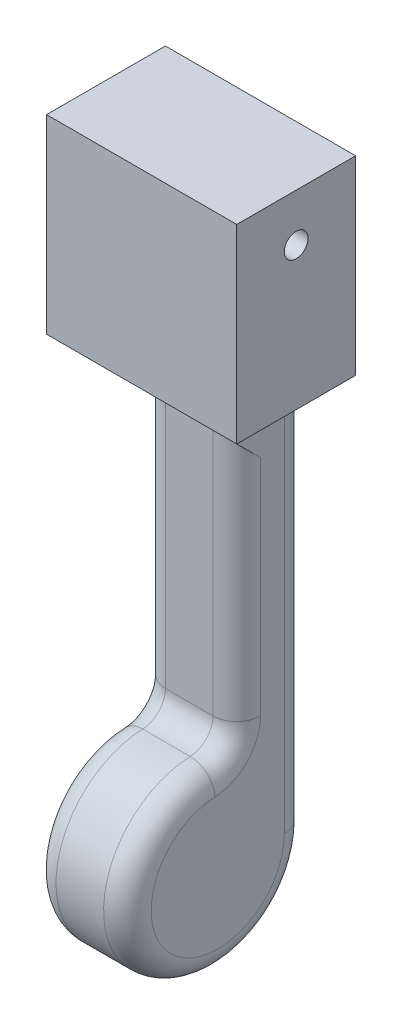
ISO-10303-21;
HEADER;
FILE_DESCRIPTION(('STEP AP214'),'2;1');
FILE_NAME('part.step','',(''),(''),'','','');
FILE_SCHEMA(('AUTOMOTIVE_DESIGN { 1 0 10303 214 1 1 1 1 }'));
ENDSEC;
DATA;
#1=APPLICATION_CONTEXT('core data for automotive mechanical design processes');
#2=APPLICATION_PROTOCOL_DEFINITION('international standard','automotive_design',2000,#1);
#3=PRODUCT_CONTEXT('',#1,'mechanical');
#4=PRODUCT('Part','Part','',(#3));
#5=PRODUCT_RELATED_PRODUCT_CATEGORY('part','',(#4));
#6=PRODUCT_DEFINITION_FORMATION('','',#4);
#7=PRODUCT_DEFINITION_CONTEXT('part definition',#1,'design');
#8=PRODUCT_DEFINITION('design','',#6,#7);
#9=PRODUCT_DEFINITION_SHAPE('','',#8);
#10=(LENGTH_UNIT() NAMED_UNIT(*) SI_UNIT(.MILLI.,.METRE.));
#11=(NAMED_UNIT(*) PLANE_ANGLE_UNIT() SI_UNIT($,.RADIAN.));
#12=(NAMED_UNIT(*) SI_UNIT($,.STERADIAN.) SOLID_ANGLE_UNIT());
#13=UNCERTAINTY_MEASURE_WITH_UNIT(LENGTH_MEASURE(1.E-05),#10,'distance_accuracy_value','');
#14=(GEOMETRIC_REPRESENTATION_CONTEXT(3) GLOBAL_UNCERTAINTY_ASSIGNED_CONTEXT((#13)) GLOBAL_UNIT_ASSIGNED_CONTEXT((#10,
#11,#12)) REPRESENTATION_CONTEXT('',''));
#15=CARTESIAN_POINT('',(0.,0.,0.));
#16=DIRECTION('',(0.,0.,1.));
#17=DIRECTION('',(1.,0.,0.));
#18=AXIS2_PLACEMENT_3D('',#15,#16,#17);
#19=CARTESIAN_POINT('',(20.,-20.,0.));
#20=DIRECTION('',(0.,-1.,0.));
#21=DIRECTION('',(0.,0.,-1.));
#22=AXIS2_PLACEMENT_3D('',#19,#20,#21);
#23=PLANE('',#22);
#24=DIRECTION('',(-1.,0.,0.));
#25=VECTOR('',#24,1.);
#26=CARTESIAN_POINT('',(20.,-20.,-12.5));
#27=LINE('',#26,#25);
#28=CARTESIAN_POINT('',(-5.,-20.,-12.5));
#29=VERTEX_POINT('',#28);
#30=CARTESIAN_POINT('',(-20.,-20.,-12.5));
#31=VERTEX_POINT('',#30);
#32=EDGE_CURVE('E162',#29,#31,#27,.T.);
#33=ORIENTED_EDGE('',*,*,#32,.F.);
#34=CARTESIAN_POINT('',(-5.,-20.,-7.5));
#35=DIRECTION('',(0.,-1.,0.));
#36=DIRECTION('',(0.,0.,-1.));
#37=AXIS2_PLACEMENT_3D('',#34,#35,#36);
#38=CIRCLE('',#37,5.);
#39=CARTESIAN_POINT('',(-10.,-20.,-7.5));
#40=VERTEX_POINT('',#39);
#41=EDGE_CURVE('E51',#29,#40,#38,.F.);
#42=ORIENTED_EDGE('',*,*,#41,.T.);
#43=DIRECTION('',(0.,0.,1.));
#44=VECTOR('',#43,1.);
#45=CARTESIAN_POINT('',(-10.,-20.,0.));
#46=LINE('',#45,#44);
#47=CARTESIAN_POINT('',(-10.,-20.,12.5));
#48=VERTEX_POINT('',#47);
#49=EDGE_CURVE('E161',#40,#48,#46,.T.);
#50=ORIENTED_EDGE('',*,*,#49,.T.);
#51=DIRECTION('',(-1.,0.,0.));
#52=VECTOR('',#51,1.);
#53=CARTESIAN_POINT('',(20.,-20.,12.5));
#54=LINE('',#53,#52);
#55=CARTESIAN_POINT('',(-20.,-20.,12.5));
#56=VERTEX_POINT('',#55);
#57=EDGE_CURVE('E186',#48,#56,#54,.T.);
#58=ORIENTED_EDGE('',*,*,#57,.T.);
#59=DIRECTION('',(0.,0.,1.));
#60=VECTOR('',#59,1.);
#61=CARTESIAN_POINT('',(-20.,-20.,0.));
#62=LINE('',#61,#60);
#63=EDGE_CURVE('E190',#31,#56,#62,.T.);
#64=ORIENTED_EDGE('',*,*,#63,.F.);
#65=EDGE_LOOP('',(#33,#42,#50,#58,#64));
#66=FACE_BOUND('',#65,.T.);
#67=ADVANCED_FACE('F42',(#66),#23,.T.);
#68=CARTESIAN_POINT('',(10.,0.,2.5));
#69=DIRECTION('',(0.,0.,-1.));
#70=DIRECTION('',(-1.,0.,0.));
#71=AXIS2_PLACEMENT_3D('',#68,#69,#70);
#72=PLANE('',#71);
#73=DIRECTION('',(-1.,0.,0.));
#74=VECTOR('',#73,1.);
#75=CARTESIAN_POINT('',(10.,-30.0000000000001,2.5));
#76=LINE('',#75,#74);
#77=CARTESIAN_POINT('',(5.,-30.0000000000001,2.5));
#78=VERTEX_POINT('',#77);
#79=CARTESIAN_POINT('',(-5.,-30.0000000000001,2.5));
#80=VERTEX_POINT('',#79);
#81=EDGE_CURVE('E211',#78,#80,#76,.T.);
#82=ORIENTED_EDGE('',*,*,#81,.T.);
#83=DIRECTION('',(0.,-1.,0.));
#84=VECTOR('',#83,1.);
#85=CARTESIAN_POINT('',(-5.,0.,2.5));
#86=LINE('',#85,#84);
#87=CARTESIAN_POINT('',(-5.,-82.0208423834364,2.5));
#88=VERTEX_POINT('',#87);
#89=EDGE_CURVE('E223',#80,#88,#86,.T.);
#90=ORIENTED_EDGE('',*,*,#89,.T.);
#91=DIRECTION('',(1.,0.,0.));
#92=VECTOR('',#91,1.);
#93=CARTESIAN_POINT('',(10.,-82.0208423834364,2.5));
#94=LINE('',#93,#92);
#95=CARTESIAN_POINT('',(5.,-82.0208423834364,2.5));
#96=VERTEX_POINT('',#95);
#97=EDGE_CURVE('E219',#88,#96,#94,.T.);
#98=ORIENTED_EDGE('',*,*,#97,.T.);
#99=DIRECTION('',(0.,-1.,0.));
#100=VECTOR('',#99,1.);
#101=CARTESIAN_POINT('',(5.,-30.0000000000001,2.5));
#102=LINE('',#101,#100);
#103=EDGE_CURVE('E221',#96,#78,#102,.F.);
#104=ORIENTED_EDGE('',*,*,#103,.T.);
#105=EDGE_LOOP('',(#82,#90,#98,#104));
#106=FACE_BOUND('',#105,.T.);
#107=ADVANCED_FACE('F349',(#106),#72,.F.);
#108=CARTESIAN_POINT('',(10.,-106.,6.49999999999999));
#109=DIRECTION('',(-1.,0.,0.));
#110=DIRECTION('',(0.,0.,1.));
#111=AXIS2_PLACEMENT_3D('',#108,#109,#110);
#112=CYLINDRICAL_SURFACE('',#111,19.);
#113=DIRECTION('',(-1.,0.,0.));
#114=VECTOR('',#113,1.);
#115=CARTESIAN_POINT('',(10.,-87.0165002202205,7.29166666666667));
#116=LINE('',#115,#114);
#117=CARTESIAN_POINT('',(5.,-87.0165002202205,7.29166666666667));
#118=VERTEX_POINT('',#117);
#119=CARTESIAN_POINT('',(-5.,-87.0165002202205,7.29166666666667));
#120=VERTEX_POINT('',#119);
#121=EDGE_CURVE('E59',#118,#120,#116,.T.);
#122=ORIENTED_EDGE('',*,*,#121,.T.);
#123=CARTESIAN_POINT('',(-5.,-106.,6.49999999999999));
#124=DIRECTION('',(1.,0.,0.));
#125=DIRECTION('',(0.,0.,-1.));
#126=AXIS2_PLACEMENT_3D('',#123,#124,#125);
#127=CIRCLE('',#126,19.);
#128=CARTESIAN_POINT('',(-5.,-106.,-12.5));
#129=VERTEX_POINT('',#128);
#130=EDGE_CURVE('E252',#120,#129,#127,.T.);
#131=ORIENTED_EDGE('',*,*,#130,.T.);
#132=DIRECTION('',(-1.,0.,0.));
#133=VECTOR('',#132,1.);
#134=CARTESIAN_POINT('',(10.,-106.,-12.5));
#135=LINE('',#134,#133);
#136=CARTESIAN_POINT('',(5.,-106.,-12.5));
#137=VERTEX_POINT('',#136);
#138=EDGE_CURVE('E208',#137,#129,#135,.T.);
#139=ORIENTED_EDGE('',*,*,#138,.F.);
#140=CARTESIAN_POINT('',(5.,-106.,6.49999999999999));
#141=DIRECTION('',(1.,0.,0.));
#142=DIRECTION('',(0.,0.,-1.));
#143=AXIS2_PLACEMENT_3D('',#140,#141,#142);
#144=CIRCLE('',#143,19.);
#145=EDGE_CURVE('E64',#137,#118,#144,.F.);
#146=ORIENTED_EDGE('',*,*,#145,.T.);
#147=EDGE_LOOP('',(#122,#131,#139,#146));
#148=FACE_BOUND('',#147,.T.);
#149=ADVANCED_FACE('F315',(#148),#112,.T.);
#150=CARTESIAN_POINT('',(10.,0.,-12.5));
#151=DIRECTION('',(0.,0.,-1.));
#152=DIRECTION('',(0.,1.,0.));
#153=AXIS2_PLACEMENT_3D('',#150,#151,#152);
#154=PLANE('',#153);
#155=ORIENTED_EDGE('',*,*,#138,.T.);
#156=DIRECTION('',(0.,-1.,0.));
#157=VECTOR('',#156,1.);
#158=CARTESIAN_POINT('',(-5.,-20.,-12.5));
#159=LINE('',#158,#157);
#160=EDGE_CURVE('E247',#129,#29,#159,.F.);
#161=ORIENTED_EDGE('',*,*,#160,.T.);
#162=ORIENTED_EDGE('',*,*,#32,.T.);
#163=DIRECTION('',(0.,1.,0.));
#164=VECTOR('',#163,1.);
#165=CARTESIAN_POINT('',(-20.,0.,-12.5));
#166=LINE('',#165,#164);
#167=CARTESIAN_POINT('',(-20.,20.,-12.5));
#168=VERTEX_POINT('',#167);
#169=EDGE_CURVE('E193',#31,#168,#166,.T.);
#170=ORIENTED_EDGE('',*,*,#169,.T.);
#171=DIRECTION('',(-1.,0.,0.));
#172=VECTOR('',#171,1.);
#173=CARTESIAN_POINT('',(20.,20.,-12.5));
#174=LINE('',#173,#172);
#175=CARTESIAN_POINT('',(20.,20.,-12.5));
#176=VERTEX_POINT('',#175);
#177=EDGE_CURVE('E169',#176,#168,#174,.T.);
#178=ORIENTED_EDGE('',*,*,#177,.F.);
#179=DIRECTION('',(0.,1.,0.));
#180=VECTOR('',#179,1.);
#181=CARTESIAN_POINT('',(20.,0.,-12.5));
#182=LINE('',#181,#180);
#183=CARTESIAN_POINT('',(20.,-20.,-12.5));
#184=VERTEX_POINT('',#183);
#185=EDGE_CURVE('E165',#184,#176,#182,.T.);
#186=ORIENTED_EDGE('',*,*,#185,.F.);
#187=CARTESIAN_POINT('',(5.,-20.,-12.5));
#188=VERTEX_POINT('',#187);
#189=EDGE_CURVE('E150',#184,#188,#27,.T.);
#190=ORIENTED_EDGE('',*,*,#189,.T.);
#191=DIRECTION('',(0.,-1.,0.));
#192=VECTOR('',#191,1.);
#193=CARTESIAN_POINT('',(5.,0.,-12.5));
#194=LINE('',#193,#192);
#195=EDGE_CURVE('E245',#188,#137,#194,.T.);
#196=ORIENTED_EDGE('',*,*,#195,.T.);
#197=EDGE_LOOP('',(#155,#161,#162,#170,#178,#186,#190,#196));
#198=FACE_BOUND('',#197,.T.);
#199=ADVANCED_FACE('F167',(#198),#154,.T.);
#200=CARTESIAN_POINT('',(10.,0.,0.));
#201=DIRECTION('',(1.,0.,0.));
#202=DIRECTION('',(0.,0.,-1.));
#203=AXIS2_PLACEMENT_3D('',#200,#201,#202);
#204=PLANE('',#203);
#205=DIRECTION('',(0.,-0.707106781186551,-0.707106781186544));
#206=VECTOR('',#205,1.);
#207=CARTESIAN_POINT('',(10.,-30.0000000000001,2.5));
#208=LINE('',#207,#206);
#209=CARTESIAN_POINT('',(10.,-20.,12.5));
#210=VERTEX_POINT('',#209);
#211=CARTESIAN_POINT('',(10.,-35.0000000000001,-2.5));
#212=VERTEX_POINT('',#211);
#213=EDGE_CURVE('E217',#210,#212,#208,.T.);
#214=ORIENTED_EDGE('',*,*,#213,.T.);
#215=DIRECTION('',(0.,-1.,0.));
#216=VECTOR('',#215,1.);
#217=CARTESIAN_POINT('',(10.,-87.4258243789933,-2.5));
#218=LINE('',#217,#216);
#219=CARTESIAN_POINT('',(10.,-82.0208423834364,-2.5));
#220=VERTEX_POINT('',#219);
#221=EDGE_CURVE('E243',#212,#220,#218,.T.);
#222=ORIENTED_EDGE('',*,*,#221,.T.);
#223=CARTESIAN_POINT('',(10.,-82.0208423834364,7.5));
#224=DIRECTION('',(1.,0.,0.));
#225=DIRECTION('',(0.,0.,-1.));
#226=AXIS2_PLACEMENT_3D('',#223,#224,#225);
#227=CIRCLE('',#226,10.);
#228=CARTESIAN_POINT('',(10.,-92.0121580570046,7.08333333333333));
#229=VERTEX_POINT('',#228);
#230=EDGE_CURVE('E240',#229,#220,#227,.T.);
#231=ORIENTED_EDGE('',*,*,#230,.F.);
#232=CARTESIAN_POINT('',(10.,-106.,6.49999999999999));
#233=DIRECTION('',(1.,0.,0.));
#234=DIRECTION('',(0.,0.,-1.));
#235=AXIS2_PLACEMENT_3D('',#232,#233,#234);
#236=CIRCLE('',#235,14.);
#237=CARTESIAN_POINT('',(10.,-106.,-7.50000000000001));
#238=VERTEX_POINT('',#237);
#239=EDGE_CURVE('E236',#229,#238,#236,.T.);
#240=ORIENTED_EDGE('',*,*,#239,.T.);
#241=DIRECTION('',(0.,-1.,0.));
#242=VECTOR('',#241,1.);
#243=CARTESIAN_POINT('',(10.,0.,-7.5));
#244=LINE('',#243,#242);
#245=CARTESIAN_POINT('',(10.,-20.,-7.5));
#246=VERTEX_POINT('',#245);
#247=EDGE_CURVE('E238',#238,#246,#244,.F.);
#248=ORIENTED_EDGE('',*,*,#247,.T.);
#249=DIRECTION('',(0.,0.,1.));
#250=VECTOR('',#249,1.);
#251=CARTESIAN_POINT('',(10.,-20.,0.));
#252=LINE('',#251,#250);
#253=EDGE_CURVE('E206',#246,#210,#252,.T.);
#254=ORIENTED_EDGE('',*,*,#253,.T.);
#255=EDGE_LOOP('',(#214,#222,#231,#240,#248,#254));
#256=FACE_BOUND('',#255,.T.);
#257=ADVANCED_FACE('F289',(#256),#204,.T.);
#258=CARTESIAN_POINT('',(-10.,0.,0.));
#259=DIRECTION('',(1.,0.,0.));
#260=DIRECTION('',(0.,0.,-1.));
#261=AXIS2_PLACEMENT_3D('',#258,#259,#260);
#262=PLANE('',#261);
#263=DIRECTION('',(0.,-1.,0.));
#264=VECTOR('',#263,1.);
#265=CARTESIAN_POINT('',(-10.,0.,-2.5));
#266=LINE('',#265,#264);
#267=CARTESIAN_POINT('',(-10.,-82.0208423834364,-2.5));
#268=VERTEX_POINT('',#267);
#269=CARTESIAN_POINT('',(-10.,-35.0000000000001,-2.5));
#270=VERTEX_POINT('',#269);
#271=EDGE_CURVE('E233',#268,#270,#266,.F.);
#272=ORIENTED_EDGE('',*,*,#271,.T.);
#273=DIRECTION('',(0.,0.707106781186551,0.707106781186544));
#274=VECTOR('',#273,1.);
#275=CARTESIAN_POINT('',(-10.,-16.2499999999999,16.2500000000001));
#276=LINE('',#275,#274);
#277=EDGE_CURVE('E214',#270,#48,#276,.T.);
#278=ORIENTED_EDGE('',*,*,#277,.T.);
#279=ORIENTED_EDGE('',*,*,#49,.F.);
#280=DIRECTION('',(0.,-1.,0.));
#281=VECTOR('',#280,1.);
#282=CARTESIAN_POINT('',(-10.,-106.,-7.5));
#283=LINE('',#282,#281);
#284=CARTESIAN_POINT('',(-10.,-106.,-7.50000000000001));
#285=VERTEX_POINT('',#284);
#286=EDGE_CURVE('E231',#40,#285,#283,.T.);
#287=ORIENTED_EDGE('',*,*,#286,.T.);
#288=CARTESIAN_POINT('',(-10.,-106.,6.49999999999999));
#289=DIRECTION('',(1.,0.,0.));
#290=DIRECTION('',(0.,0.,-1.));
#291=AXIS2_PLACEMENT_3D('',#288,#289,#290);
#292=CIRCLE('',#291,14.);
#293=CARTESIAN_POINT('',(-10.,-92.0121580570046,7.08333333333333));
#294=VERTEX_POINT('',#293);
#295=EDGE_CURVE('E229',#285,#294,#292,.F.);
#296=ORIENTED_EDGE('',*,*,#295,.T.);
#297=CARTESIAN_POINT('',(-10.,-82.0208423834364,7.5));
#298=DIRECTION('',(1.,0.,0.));
#299=DIRECTION('',(0.,0.,-1.));
#300=AXIS2_PLACEMENT_3D('',#297,#298,#299);
#301=CIRCLE('',#300,10.);
#302=EDGE_CURVE('E226',#268,#294,#301,.F.);
#303=ORIENTED_EDGE('',*,*,#302,.F.);
#304=EDGE_LOOP('',(#272,#278,#279,#287,#296,#303));
#305=FACE_BOUND('',#304,.T.);
#306=ADVANCED_FACE('F325',(#305),#262,.F.);
#307=CARTESIAN_POINT('',(20.,-20.,12.5));
#308=VERTEX_POINT('',#307);
#309=EDGE_CURVE('E200',#308,#210,#54,.T.);
#310=ORIENTED_EDGE('',*,*,#309,.T.);
#311=ORIENTED_EDGE('',*,*,#253,.F.);
#312=CARTESIAN_POINT('',(5.,-20.,-7.5));
#313=DIRECTION('',(0.,-1.,0.));
#314=DIRECTION('',(0.,0.,-1.));
#315=AXIS2_PLACEMENT_3D('',#312,#313,#314);
#316=CIRCLE('',#315,5.);
#317=EDGE_CURVE('E11',#246,#188,#316,.F.);
#318=ORIENTED_EDGE('',*,*,#317,.T.);
#319=ORIENTED_EDGE('',*,*,#189,.F.);
#320=DIRECTION('',(0.,0.,1.));
#321=VECTOR('',#320,1.);
#322=CARTESIAN_POINT('',(20.,-20.,0.));
#323=LINE('',#322,#321);
#324=EDGE_CURVE('E155',#184,#308,#323,.T.);
#325=ORIENTED_EDGE('',*,*,#324,.T.);
#326=EDGE_LOOP('',(#310,#311,#318,#319,#325));
#327=FACE_BOUND('',#326,.T.);
#328=ADVANCED_FACE('F153',(#327),#23,.T.);
#329=CARTESIAN_POINT('',(20.,20.,0.));
#330=DIRECTION('',(0.,1.,0.));
#331=DIRECTION('',(0.,0.,1.));
#332=AXIS2_PLACEMENT_3D('',#329,#330,#331);
#333=PLANE('',#332);
#334=DIRECTION('',(0.,0.,-1.));
#335=VECTOR('',#334,1.);
#336=CARTESIAN_POINT('',(-20.,20.,0.));
#337=LINE('',#336,#335);
#338=CARTESIAN_POINT('',(-20.,20.,12.5));
#339=VERTEX_POINT('',#338);
#340=EDGE_CURVE('E195',#339,#168,#337,.T.);
#341=ORIENTED_EDGE('',*,*,#340,.F.);
#342=DIRECTION('',(-1.,0.,0.));
#343=VECTOR('',#342,1.);
#344=CARTESIAN_POINT('',(20.,20.,12.5));
#345=LINE('',#344,#343);
#346=CARTESIAN_POINT('',(20.,20.,12.5));
#347=VERTEX_POINT('',#346);
#348=EDGE_CURVE('E202',#347,#339,#345,.T.);
#349=ORIENTED_EDGE('',*,*,#348,.F.);
#350=DIRECTION('',(0.,0.,-1.));
#351=VECTOR('',#350,1.);
#352=CARTESIAN_POINT('',(20.,20.,0.));
#353=LINE('',#352,#351);
#354=EDGE_CURVE('E173',#347,#176,#353,.T.);
#355=ORIENTED_EDGE('',*,*,#354,.T.);
#356=ORIENTED_EDGE('',*,*,#177,.T.);
#357=EDGE_LOOP('',(#341,#349,#355,#356));
#358=FACE_BOUND('',#357,.T.);
#359=ADVANCED_FACE('F336',(#358),#333,.T.);
#360=CARTESIAN_POINT('',(20.,10.,0.));
#361=DIRECTION('',(-1.,0.,0.));
#362=DIRECTION('',(0.,0.,1.));
#363=AXIS2_PLACEMENT_3D('',#360,#361,#362);
#364=CYLINDRICAL_SURFACE('',#363,2.5);
#365=CARTESIAN_POINT('',(20.,10.,0.));
#366=DIRECTION('',(1.,0.,0.));
#367=DIRECTION('',(0.,0.,-1.));
#368=AXIS2_PLACEMENT_3D('',#365,#366,#367);
#369=CIRCLE('',#368,2.5);
#370=CARTESIAN_POINT('',(20.,10.,-2.5));
#371=VERTEX_POINT('',#370);
#372=EDGE_CURVE('E178',#371,#371,#369,.T.);
#373=ORIENTED_EDGE('',*,*,#372,.T.);
#374=EDGE_LOOP('',(#373));
#375=FACE_BOUND('',#374,.T.);
#376=CARTESIAN_POINT('',(-20.,10.,0.));
#377=DIRECTION('',(1.,0.,0.));
#378=DIRECTION('',(0.,0.,-1.));
#379=AXIS2_PLACEMENT_3D('',#376,#377,#378);
#380=CIRCLE('',#379,2.5);
#381=CARTESIAN_POINT('',(-20.,10.,-2.5));
#382=VERTEX_POINT('',#381);
#383=EDGE_CURVE('E187',#382,#382,#380,.T.);
#384=ORIENTED_EDGE('',*,*,#383,.F.);
#385=EDGE_LOOP('',(#384));
#386=FACE_BOUND('',#385,.T.);
#387=ADVANCED_FACE('F338',(#375,#386),#364,.F.);
#388=CARTESIAN_POINT('',(20.,0.,12.5));
#389=DIRECTION('',(0.,0.,1.));
#390=DIRECTION('',(1.,0.,0.));
#391=AXIS2_PLACEMENT_3D('',#388,#389,#390);
#392=PLANE('',#391);
#393=DIRECTION('',(0.,1.,0.));
#394=VECTOR('',#393,1.);
#395=CARTESIAN_POINT('',(-20.,0.,12.5));
#396=LINE('',#395,#394);
#397=EDGE_CURVE('E181',#56,#339,#396,.T.);
#398=ORIENTED_EDGE('',*,*,#397,.F.);
#399=ORIENTED_EDGE('',*,*,#57,.F.);
#400=EDGE_CURVE('E203',#210,#48,#54,.T.);
#401=ORIENTED_EDGE('',*,*,#400,.F.);
#402=ORIENTED_EDGE('',*,*,#309,.F.);
#403=DIRECTION('',(0.,1.,0.));
#404=VECTOR('',#403,1.);
#405=CARTESIAN_POINT('',(20.,0.,12.5));
#406=LINE('',#405,#404);
#407=EDGE_CURVE('E177',#308,#347,#406,.T.);
#408=ORIENTED_EDGE('',*,*,#407,.T.);
#409=ORIENTED_EDGE('',*,*,#348,.T.);
#410=EDGE_LOOP('',(#398,#399,#401,#402,#408,#409));
#411=FACE_BOUND('',#410,.T.);
#412=ADVANCED_FACE('F330',(#411),#392,.T.);
#413=CARTESIAN_POINT('',(20.,0.,0.));
#414=DIRECTION('',(1.,0.,0.));
#415=DIRECTION('',(0.,0.,-1.));
#416=AXIS2_PLACEMENT_3D('',#413,#414,#415);
#417=PLANE('',#416);
#418=ORIENTED_EDGE('',*,*,#372,.F.);
#419=EDGE_LOOP('',(#418));
#420=FACE_BOUND('',#419,.T.);
#421=ORIENTED_EDGE('',*,*,#324,.F.);
#422=ORIENTED_EDGE('',*,*,#185,.T.);
#423=ORIENTED_EDGE('',*,*,#354,.F.);
#424=ORIENTED_EDGE('',*,*,#407,.F.);
#425=EDGE_LOOP('',(#421,#422,#423,#424));
#426=FACE_BOUND('',#425,.T.);
#427=ADVANCED_FACE('F175',(#420,#426),#417,.T.);
#428=CARTESIAN_POINT('',(-20.,0.,0.));
#429=DIRECTION('',(1.,0.,0.));
#430=DIRECTION('',(0.,0.,-1.));
#431=AXIS2_PLACEMENT_3D('',#428,#429,#430);
#432=PLANE('',#431);
#433=ORIENTED_EDGE('',*,*,#383,.T.);
#434=EDGE_LOOP('',(#433));
#435=FACE_BOUND('',#434,.T.);
#436=ORIENTED_EDGE('',*,*,#63,.T.);
#437=ORIENTED_EDGE('',*,*,#397,.T.);
#438=ORIENTED_EDGE('',*,*,#340,.T.);
#439=ORIENTED_EDGE('',*,*,#169,.F.);
#440=EDGE_LOOP('',(#436,#437,#438,#439));
#441=FACE_BOUND('',#440,.T.);
#442=ADVANCED_FACE('F333',(#435,#441),#432,.F.);
#443=CARTESIAN_POINT('',(10.,-30.0000000000001,2.5));
#444=DIRECTION('',(0.,0.707106781186544,-0.707106781186552));
#445=DIRECTION('',(-1.,0.,0.));
#446=AXIS2_PLACEMENT_3D('',#443,#444,#445);
#447=PLANE('',#446);
#448=ORIENTED_EDGE('',*,*,#213,.F.);
#449=ORIENTED_EDGE('',*,*,#400,.T.);
#450=ORIENTED_EDGE('',*,*,#277,.F.);
#451=CARTESIAN_POINT('',(-5.,-35.0000000000001,-2.5));
#452=DIRECTION('',(0.,0.707106781186544,-0.707106781186552));
#453=DIRECTION('',(0.,-0.707106781186551,-0.707106781186544));
#454=AXIS2_PLACEMENT_3D('',#451,#452,#453);
#455=ELLIPSE('',#454,7.07106781186551,5.);
#456=EDGE_CURVE('E254',#270,#80,#455,.T.);
#457=ORIENTED_EDGE('',*,*,#456,.T.);
#458=ORIENTED_EDGE('',*,*,#81,.F.);
#459=CARTESIAN_POINT('',(5.,-35.0000000000001,-2.5));
#460=DIRECTION('',(0.,0.707106781186544,-0.707106781186552));
#461=DIRECTION('',(0.,0.707106781186551,0.707106781186544));
#462=AXIS2_PLACEMENT_3D('',#459,#460,#461);
#463=ELLIPSE('',#462,7.07106781186551,5.);
#464=EDGE_CURVE('E256',#78,#212,#463,.T.);
#465=ORIENTED_EDGE('',*,*,#464,.T.);
#466=EDGE_LOOP('',(#448,#449,#450,#457,#458,#465));
#467=FACE_BOUND('',#466,.T.);
#468=ADVANCED_FACE('F295',(#467),#447,.F.);
#469=CARTESIAN_POINT('',(5.,0.,-7.5));
#470=DIRECTION('',(0.,-1.,0.));
#471=DIRECTION('',(0.,0.,-1.));
#472=AXIS2_PLACEMENT_3D('',#469,#470,#471);
#473=CYLINDRICAL_SURFACE('',#472,5.);
#474=ORIENTED_EDGE('',*,*,#317,.F.);
#475=ORIENTED_EDGE('',*,*,#247,.F.);
#476=CARTESIAN_POINT('',(5.,-106.,-7.5));
#477=DIRECTION('',(0.,-1.,0.));
#478=DIRECTION('',(0.,0.,-1.));
#479=AXIS2_PLACEMENT_3D('',#476,#477,#478);
#480=CIRCLE('',#479,5.);
#481=EDGE_CURVE('E46',#137,#238,#480,.T.);
#482=ORIENTED_EDGE('',*,*,#481,.F.);
#483=ORIENTED_EDGE('',*,*,#195,.F.);
#484=EDGE_LOOP('',(#474,#475,#482,#483));
#485=FACE_BOUND('',#484,.T.);
#486=ADVANCED_FACE('F44',(#485),#473,.T.);
#487=CARTESIAN_POINT('',(5.,0.,-2.5));
#488=DIRECTION('',(0.,1.,0.));
#489=DIRECTION('',(0.,0.,1.));
#490=AXIS2_PLACEMENT_3D('',#487,#488,#489);
#491=CYLINDRICAL_SURFACE('',#490,5.);
#492=ORIENTED_EDGE('',*,*,#464,.F.);
#493=ORIENTED_EDGE('',*,*,#103,.F.);
#494=CARTESIAN_POINT('',(5.,-82.0208423834364,-2.5));
#495=DIRECTION('',(0.,-1.,0.));
#496=DIRECTION('',(0.,0.,-1.));
#497=AXIS2_PLACEMENT_3D('',#494,#495,#496);
#498=CIRCLE('',#497,5.);
#499=EDGE_CURVE('E276',#220,#96,#498,.T.);
#500=ORIENTED_EDGE('',*,*,#499,.F.);
#501=ORIENTED_EDGE('',*,*,#221,.F.);
#502=EDGE_LOOP('',(#492,#493,#500,#501));
#503=FACE_BOUND('',#502,.T.);
#504=ADVANCED_FACE('F301',(#503),#491,.T.);
#505=CARTESIAN_POINT('',(5.,-106.,6.49999999999999));
#506=DIRECTION('',(1.,0.,0.));
#507=DIRECTION('',(0.,0.,-1.));
#508=AXIS2_PLACEMENT_3D('',#505,#506,#507);
#509=TOROIDAL_SURFACE('',#508,14.,5.);
#510=ORIENTED_EDGE('',*,*,#481,.T.);
#511=ORIENTED_EDGE('',*,*,#239,.F.);
#512=CARTESIAN_POINT('',(5.,-92.0121580570046,7.08333333333333));
#513=DIRECTION('',(0.,0.0416666666666672,-0.999131567356817));
#514=DIRECTION('',(0.,0.999131567356817,0.0416666666666672));
#515=AXIS2_PLACEMENT_3D('',#512,#513,#514);
#516=CIRCLE('',#515,5.);
#517=EDGE_CURVE('E274',#118,#229,#516,.T.);
#518=ORIENTED_EDGE('',*,*,#517,.F.);
#519=ORIENTED_EDGE('',*,*,#145,.F.);
#520=EDGE_LOOP('',(#510,#511,#518,#519));
#521=FACE_BOUND('',#520,.T.);
#522=ADVANCED_FACE('F285',(#521),#509,.T.);
#523=CARTESIAN_POINT('',(5.,-82.0208423834364,7.5));
#524=DIRECTION('',(1.,0.,0.));
#525=DIRECTION('',(0.,0.,-1.));
#526=AXIS2_PLACEMENT_3D('',#523,#524,#525);
#527=TOROIDAL_SURFACE('',#526,10.,5.);
#528=ORIENTED_EDGE('',*,*,#230,.T.);
#529=ORIENTED_EDGE('',*,*,#499,.T.);
#530=CARTESIAN_POINT('',(5.,-82.0208423834364,7.5));
#531=DIRECTION('',(1.,0.,0.));
#532=DIRECTION('',(0.,0.,-1.));
#533=AXIS2_PLACEMENT_3D('',#530,#531,#532);
#534=CIRCLE('',#533,5.);
#535=EDGE_CURVE('E271',#118,#96,#534,.T.);
#536=ORIENTED_EDGE('',*,*,#535,.F.);
#537=ORIENTED_EDGE('',*,*,#517,.T.);
#538=EDGE_LOOP('',(#528,#529,#536,#537));
#539=FACE_BOUND('',#538,.T.);
#540=ADVANCED_FACE('F302',(#539),#527,.T.);
#541=CARTESIAN_POINT('',(-5.,0.,-7.5));
#542=DIRECTION('',(0.,1.,0.));
#543=DIRECTION('',(0.,0.,1.));
#544=AXIS2_PLACEMENT_3D('',#541,#542,#543);
#545=CYLINDRICAL_SURFACE('',#544,5.);
#546=ORIENTED_EDGE('',*,*,#41,.F.);
#547=ORIENTED_EDGE('',*,*,#160,.F.);
#548=CARTESIAN_POINT('',(-5.,-106.,-7.5));
#549=DIRECTION('',(0.,-1.,0.));
#550=DIRECTION('',(0.,0.,-1.));
#551=AXIS2_PLACEMENT_3D('',#548,#549,#550);
#552=CIRCLE('',#551,5.);
#553=EDGE_CURVE('E268',#285,#129,#552,.T.);
#554=ORIENTED_EDGE('',*,*,#553,.F.);
#555=ORIENTED_EDGE('',*,*,#286,.F.);
#556=EDGE_LOOP('',(#546,#547,#554,#555));
#557=FACE_BOUND('',#556,.T.);
#558=ADVANCED_FACE('F319',(#557),#545,.T.);
#559=CARTESIAN_POINT('',(10.,-82.0208423834364,7.5));
#560=DIRECTION('',(-1.,0.,0.));
#561=DIRECTION('',(0.,0.,1.));
#562=AXIS2_PLACEMENT_3D('',#559,#560,#561);
#563=CYLINDRICAL_SURFACE('',#562,5.);
#564=ORIENTED_EDGE('',*,*,#535,.T.);
#565=ORIENTED_EDGE('',*,*,#97,.F.);
#566=CARTESIAN_POINT('',(-5.,-82.0208423834364,7.5));
#567=DIRECTION('',(1.,0.,0.));
#568=DIRECTION('',(0.,0.,-1.));
#569=AXIS2_PLACEMENT_3D('',#566,#567,#568);
#570=CIRCLE('',#569,5.);
#571=EDGE_CURVE('E265',#120,#88,#570,.T.);
#572=ORIENTED_EDGE('',*,*,#571,.F.);
#573=ORIENTED_EDGE('',*,*,#121,.F.);
#574=EDGE_LOOP('',(#564,#565,#572,#573));
#575=FACE_BOUND('',#574,.T.);
#576=ADVANCED_FACE('F306',(#575),#563,.F.);
#577=CARTESIAN_POINT('',(-5.,-106.,6.49999999999999));
#578=DIRECTION('',(1.,0.,0.));
#579=DIRECTION('',(0.,0.,-1.));
#580=AXIS2_PLACEMENT_3D('',#577,#578,#579);
#581=TOROIDAL_SURFACE('',#580,14.,5.);
#582=ORIENTED_EDGE('',*,*,#553,.T.);
#583=ORIENTED_EDGE('',*,*,#130,.F.);
#584=CARTESIAN_POINT('',(-5.,-92.0121580570046,7.08333333333333));
#585=DIRECTION('',(0.,0.0416666666666674,-0.999131567356817));
#586=DIRECTION('',(0.,0.999131567356817,0.0416666666666674));
#587=AXIS2_PLACEMENT_3D('',#584,#585,#586);
#588=CIRCLE('',#587,5.);
#589=EDGE_CURVE('E262',#294,#120,#588,.T.);
#590=ORIENTED_EDGE('',*,*,#589,.F.);
#591=ORIENTED_EDGE('',*,*,#295,.F.);
#592=EDGE_LOOP('',(#582,#583,#590,#591));
#593=FACE_BOUND('',#592,.T.);
#594=ADVANCED_FACE('F313',(#593),#581,.T.);
#595=CARTESIAN_POINT('',(-5.,-82.0208423834364,7.5));
#596=DIRECTION('',(1.,0.,0.));
#597=DIRECTION('',(0.,0.,-1.));
#598=AXIS2_PLACEMENT_3D('',#595,#596,#597);
#599=TOROIDAL_SURFACE('',#598,10.,5.);
#600=ORIENTED_EDGE('',*,*,#589,.T.);
#601=ORIENTED_EDGE('',*,*,#571,.T.);
#602=CARTESIAN_POINT('',(-5.,-82.0208423834364,-2.5));
#603=DIRECTION('',(0.,-1.,0.));
#604=DIRECTION('',(0.,0.,-1.));
#605=AXIS2_PLACEMENT_3D('',#602,#603,#604);
#606=CIRCLE('',#605,5.);
#607=EDGE_CURVE('E260',#268,#88,#606,.F.);
#608=ORIENTED_EDGE('',*,*,#607,.F.);
#609=ORIENTED_EDGE('',*,*,#302,.T.);
#610=EDGE_LOOP('',(#600,#601,#608,#609));
#611=FACE_BOUND('',#610,.T.);
#612=ADVANCED_FACE('F310',(#611),#599,.T.);
#613=CARTESIAN_POINT('',(-5.,0.,-2.5));
#614=DIRECTION('',(0.,-1.,0.));
#615=DIRECTION('',(0.,0.,-1.));
#616=AXIS2_PLACEMENT_3D('',#613,#614,#615);
#617=CYLINDRICAL_SURFACE('',#616,5.);
#618=ORIENTED_EDGE('',*,*,#456,.F.);
#619=ORIENTED_EDGE('',*,*,#271,.F.);
#620=ORIENTED_EDGE('',*,*,#607,.T.);
#621=ORIENTED_EDGE('',*,*,#89,.F.);
#622=EDGE_LOOP('',(#618,#619,#620,#621));
#623=FACE_BOUND('',#622,.T.);
#624=ADVANCED_FACE('F369',(#623),#617,.T.);
#625=CLOSED_SHELL('',(#67,#107,#149,#199,#257,#306,#328,#359,#387,#412,#427,#442,#468,#486,#504,
#522,#540,#558,#576,#594,#612,#624));
#626=MANIFOLD_SOLID_BREP('B2',#625);
#627=ADVANCED_BREP_SHAPE_REPRESENTATION('',(#18,#626),#14);
#628=SHAPE_DEFINITION_REPRESENTATION(#9,#627);
ENDSEC;
END-ISO-10303-21;
